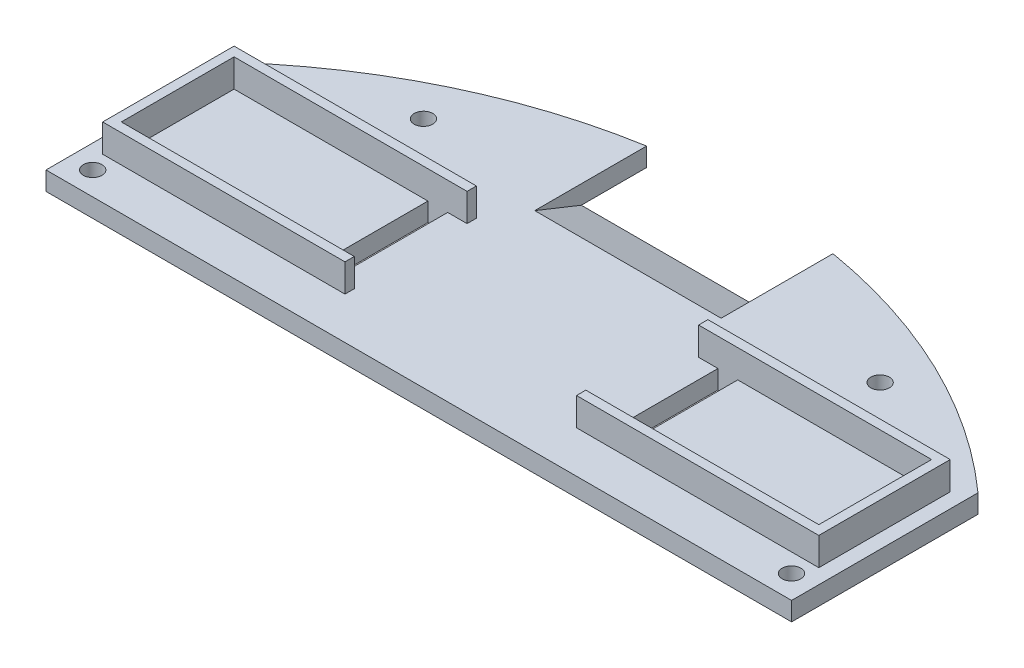
ISO-10303-21;
HEADER;
FILE_DESCRIPTION(('STEP AP214'),'2;1');
FILE_NAME('part.step','',(''),(''),'','','');
FILE_SCHEMA(('AUTOMOTIVE_DESIGN { 1 0 10303 214 1 1 1 1 }'));
ENDSEC;
DATA;
#1=APPLICATION_CONTEXT('core data for automotive mechanical design processes');
#2=APPLICATION_PROTOCOL_DEFINITION('international standard','automotive_design',2000,#1);
#3=PRODUCT_CONTEXT('',#1,'mechanical');
#4=PRODUCT('Part','Part','',(#3));
#5=PRODUCT_RELATED_PRODUCT_CATEGORY('part','',(#4));
#6=PRODUCT_DEFINITION_FORMATION('','',#4);
#7=PRODUCT_DEFINITION_CONTEXT('part definition',#1,'design');
#8=PRODUCT_DEFINITION('design','',#6,#7);
#9=PRODUCT_DEFINITION_SHAPE('','',#8);
#10=(LENGTH_UNIT() NAMED_UNIT(*) SI_UNIT(.MILLI.,.METRE.));
#11=(NAMED_UNIT(*) PLANE_ANGLE_UNIT() SI_UNIT($,.RADIAN.));
#12=(NAMED_UNIT(*) SI_UNIT($,.STERADIAN.) SOLID_ANGLE_UNIT());
#13=UNCERTAINTY_MEASURE_WITH_UNIT(LENGTH_MEASURE(1.E-05),#10,'distance_accuracy_value','');
#14=(GEOMETRIC_REPRESENTATION_CONTEXT(3) GLOBAL_UNCERTAINTY_ASSIGNED_CONTEXT((#13)) GLOBAL_UNIT_ASSIGNED_CONTEXT((#10,
#11,#12)) REPRESENTATION_CONTEXT('',''));
#15=CARTESIAN_POINT('',(0.,0.,0.));
#16=DIRECTION('',(0.,0.,1.));
#17=DIRECTION('',(1.,0.,0.));
#18=AXIS2_PLACEMENT_3D('',#15,#16,#17);
#19=CARTESIAN_POINT('',(0.,2.,34.7213595499958));
#20=DIRECTION('',(0.,-1.,0.));
#21=DIRECTION('',(0.,0.,-1.));
#22=AXIS2_PLACEMENT_3D('',#19,#20,#21);
#23=PLANE('',#22);
#24=DIRECTION('',(-1.,0.,0.));
#25=VECTOR('',#24,1.);
#26=CARTESIAN_POINT('',(-12.4199999977621,2.,4.5));
#27=LINE('',#26,#25);
#28=CARTESIAN_POINT('',(-16.62,2.,4.5));
#29=VERTEX_POINT('',#28);
#30=CARTESIAN_POINT('',(-37.42,2.,4.5));
#31=VERTEX_POINT('',#30);
#32=EDGE_CURVE('E281',#29,#31,#27,.T.);
#33=ORIENTED_EDGE('',*,*,#32,.F.);
#34=DIRECTION('',(0.,0.,1.));
#35=VECTOR('',#34,1.);
#36=CARTESIAN_POINT('',(-16.62,2.,-7.6));
#37=LINE('',#36,#35);
#38=CARTESIAN_POINT('',(-16.62,2.,-7.6));
#39=VERTEX_POINT('',#38);
#40=EDGE_CURVE('E369',#39,#29,#37,.T.);
#41=ORIENTED_EDGE('',*,*,#40,.F.);
#42=DIRECTION('',(1.,0.,0.));
#43=VECTOR('',#42,1.);
#44=CARTESIAN_POINT('',(-37.42,2.,-7.6));
#45=LINE('',#44,#43);
#46=CARTESIAN_POINT('',(-37.42,2.,-7.6));
#47=VERTEX_POINT('',#46);
#48=EDGE_CURVE('E925',#47,#39,#45,.T.);
#49=ORIENTED_EDGE('',*,*,#48,.F.);
#50=DIRECTION('',(0.,0.,-1.));
#51=VECTOR('',#50,1.);
#52=CARTESIAN_POINT('',(-37.42,2.,4.5));
#53=LINE('',#52,#51);
#54=EDGE_CURVE('E286',#31,#47,#53,.T.);
#55=ORIENTED_EDGE('',*,*,#54,.F.);
#56=EDGE_LOOP('',(#33,#41,#49,#55));
#57=FACE_BOUND('',#56,.T.);
#58=ADVANCED_FACE('F41',(#57),#23,.F.);
#59=DIRECTION('',(-1.,0.,0.));
#60=VECTOR('',#59,1.);
#61=CARTESIAN_POINT('',(12.4199999977621,2.,4.5));
#62=LINE('',#61,#60);
#63=CARTESIAN_POINT('',(14.5,2.,4.5));
#64=VERTEX_POINT('',#63);
#65=CARTESIAN_POINT('',(12.4199999977621,2.,4.5));
#66=VERTEX_POINT('',#65);
#67=EDGE_CURVE('E343',#64,#66,#62,.T.);
#68=ORIENTED_EDGE('',*,*,#67,.F.);
#69=DIRECTION('',(0.,0.,1.));
#70=VECTOR('',#69,1.);
#71=CARTESIAN_POINT('',(14.5,2.,-7.6));
#72=LINE('',#71,#70);
#73=CARTESIAN_POINT('',(14.5,2.,-7.6));
#74=VERTEX_POINT('',#73);
#75=EDGE_CURVE('E417',#74,#64,#72,.T.);
#76=ORIENTED_EDGE('',*,*,#75,.F.);
#77=DIRECTION('',(1.,0.,0.));
#78=VECTOR('',#77,1.);
#79=CARTESIAN_POINT('',(37.42,2.,-7.6));
#80=LINE('',#79,#78);
#81=CARTESIAN_POINT('',(12.4199999977621,2.,-7.6));
#82=VERTEX_POINT('',#81);
#83=EDGE_CURVE('E334',#82,#74,#80,.T.);
#84=ORIENTED_EDGE('',*,*,#83,.F.);
#85=DIRECTION('',(0.,0.,1.));
#86=VECTOR('',#85,1.);
#87=CARTESIAN_POINT('',(12.4199999977621,2.,-7.6));
#88=LINE('',#87,#86);
#89=CARTESIAN_POINT('',(12.4199999977621,2.,-8.5999999955243));
#90=VERTEX_POINT('',#89);
#91=EDGE_CURVE('E331',#90,#82,#88,.T.);
#92=ORIENTED_EDGE('',*,*,#91,.F.);
#93=DIRECTION('',(-1.,0.,0.));
#94=VECTOR('',#93,1.);
#95=CARTESIAN_POINT('',(38.4199999977621,2.,-8.5999999955243));
#96=LINE('',#95,#94);
#97=CARTESIAN_POINT('',(38.4199999977621,2.,-8.5999999955243));
#98=VERTEX_POINT('',#97);
#99=EDGE_CURVE('E328',#98,#90,#96,.T.);
#100=ORIENTED_EDGE('',*,*,#99,.F.);
#101=DIRECTION('',(0.,0.,-1.));
#102=VECTOR('',#101,1.);
#103=CARTESIAN_POINT('',(38.4199999977621,2.,5.4999999955243));
#104=LINE('',#103,#102);
#105=CARTESIAN_POINT('',(38.4199999977621,2.,5.4999999955243));
#106=VERTEX_POINT('',#105);
#107=EDGE_CURVE('E325',#106,#98,#104,.T.);
#108=ORIENTED_EDGE('',*,*,#107,.F.);
#109=DIRECTION('',(1.,0.,0.));
#110=VECTOR('',#109,1.);
#111=CARTESIAN_POINT('',(12.4199999977621,2.,5.4999999955243));
#112=LINE('',#111,#110);
#113=CARTESIAN_POINT('',(12.4199999977621,2.,5.4999999955243));
#114=VERTEX_POINT('',#113);
#115=EDGE_CURVE('E284',#114,#106,#112,.T.);
#116=ORIENTED_EDGE('',*,*,#115,.F.);
#117=DIRECTION('',(0.,0.,1.));
#118=VECTOR('',#117,1.);
#119=CARTESIAN_POINT('',(12.4199999977621,2.,4.5));
#120=LINE('',#119,#118);
#121=EDGE_CURVE('E280',#66,#114,#120,.T.);
#122=ORIENTED_EDGE('',*,*,#121,.F.);
#123=EDGE_LOOP('',(#68,#76,#84,#92,#100,#108,#116,#122));
#124=FACE_BOUND('',#123,.T.);
#125=CARTESIAN_POINT('',(24.5,2.,-15.));
#126=DIRECTION('',(0.,1.,0.));
#127=DIRECTION('',(0.,0.,-1.));
#128=AXIS2_PLACEMENT_3D('',#125,#126,#127);
#129=CIRCLE('',#128,1.00000000047268);
#130=CARTESIAN_POINT('',(24.5,2.,-16.0000000004727));
#131=VERTEX_POINT('',#130);
#132=EDGE_CURVE('E393',#131,#131,#129,.T.);
#133=ORIENTED_EDGE('',*,*,#132,.F.);
#134=EDGE_LOOP('',(#133));
#135=FACE_BOUND('',#134,.T.);
#136=CARTESIAN_POINT('',(37.4903810567666,2.,7.5));
#137=DIRECTION('',(0.,1.,0.));
#138=DIRECTION('',(0.,0.,-1.));
#139=AXIS2_PLACEMENT_3D('',#136,#137,#138);
#140=CIRCLE('',#139,0.999999999999998);
#141=CARTESIAN_POINT('',(37.4903810567666,2.,6.5));
#142=VERTEX_POINT('',#141);
#143=EDGE_CURVE('E399',#142,#142,#140,.T.);
#144=ORIENTED_EDGE('',*,*,#143,.F.);
#145=EDGE_LOOP('',(#144));
#146=FACE_BOUND('',#145,.T.);
#147=CARTESIAN_POINT('',(-24.5,2.,-15.));
#148=DIRECTION('',(0.,1.,0.));
#149=DIRECTION('',(0.,0.,1.));
#150=AXIS2_PLACEMENT_3D('',#147,#148,#149);
#151=CIRCLE('',#150,1.00000000047268);
#152=CARTESIAN_POINT('',(-24.5,2.,-13.9999999995273));
#153=VERTEX_POINT('',#152);
#154=EDGE_CURVE('E405',#153,#153,#151,.T.);
#155=ORIENTED_EDGE('',*,*,#154,.F.);
#156=EDGE_LOOP('',(#155));
#157=FACE_BOUND('',#156,.T.);
#158=CARTESIAN_POINT('',(-37.4903810567666,2.,7.5));
#159=DIRECTION('',(0.,1.,0.));
#160=DIRECTION('',(0.,0.,1.));
#161=AXIS2_PLACEMENT_3D('',#158,#159,#160);
#162=CIRCLE('',#161,0.999999999999998);
#163=CARTESIAN_POINT('',(-37.4903810567666,2.,8.5));
#164=VERTEX_POINT('',#163);
#165=EDGE_CURVE('E411',#164,#164,#162,.T.);
#166=ORIENTED_EDGE('',*,*,#165,.F.);
#167=EDGE_LOOP('',(#166));
#168=FACE_BOUND('',#167,.T.);
#169=DIRECTION('',(-1.,0.,0.));
#170=VECTOR('',#169,1.);
#171=CARTESIAN_POINT('',(0.,2.,-12.4394382810003));
#172=LINE('',#171,#170);
#173=CARTESIAN_POINT('',(10.,2.,-12.4394382810003));
#174=VERTEX_POINT('',#173);
#175=CARTESIAN_POINT('',(-10.,2.,-12.4394382810003));
#176=VERTEX_POINT('',#175);
#177=EDGE_CURVE('E492',#174,#176,#172,.T.);
#178=ORIENTED_EDGE('',*,*,#177,.T.);
#179=DIRECTION('',(0.,0.,-1.));
#180=VECTOR('',#179,1.);
#181=CARTESIAN_POINT('',(-10.,2.,-24.4394382810004));
#182=LINE('',#181,#180);
#183=CARTESIAN_POINT('',(-10.,2.,-24.4394382810004));
#184=VERTEX_POINT('',#183);
#185=EDGE_CURVE('E57',#176,#184,#182,.T.);
#186=ORIENTED_EDGE('',*,*,#185,.T.);
#187=CARTESIAN_POINT('',(0.,2.,34.7213595499958));
#188=DIRECTION('',(0.,1.,0.));
#189=DIRECTION('',(0.,0.,-1.));
#190=AXIS2_PLACEMENT_3D('',#187,#188,#189);
#191=CIRCLE('',#190,60.);
#192=CARTESIAN_POINT('',(-40.,2.,-10.));
#193=VERTEX_POINT('',#192);
#194=EDGE_CURVE('E450',#184,#193,#191,.T.);
#195=ORIENTED_EDGE('',*,*,#194,.T.);
#196=DIRECTION('',(0.,0.,1.));
#197=VECTOR('',#196,1.);
#198=CARTESIAN_POINT('',(-40.,2.,10.));
#199=LINE('',#198,#197);
#200=CARTESIAN_POINT('',(-40.,2.,10.));
#201=VERTEX_POINT('',#200);
#202=EDGE_CURVE('E452',#193,#201,#199,.T.);
#203=ORIENTED_EDGE('',*,*,#202,.T.);
#204=DIRECTION('',(1.,0.,0.));
#205=VECTOR('',#204,1.);
#206=CARTESIAN_POINT('',(-40.,2.,10.));
#207=LINE('',#206,#205);
#208=CARTESIAN_POINT('',(40.,2.,10.));
#209=VERTEX_POINT('',#208);
#210=EDGE_CURVE('E454',#201,#209,#207,.T.);
#211=ORIENTED_EDGE('',*,*,#210,.T.);
#212=DIRECTION('',(0.,0.,-1.));
#213=VECTOR('',#212,1.);
#214=CARTESIAN_POINT('',(40.,2.,10.));
#215=LINE('',#214,#213);
#216=CARTESIAN_POINT('',(40.,2.,-10.));
#217=VERTEX_POINT('',#216);
#218=EDGE_CURVE('E456',#209,#217,#215,.T.);
#219=ORIENTED_EDGE('',*,*,#218,.T.);
#220=CARTESIAN_POINT('',(0.,2.,34.7213595499958));
#221=DIRECTION('',(0.,1.,0.));
#222=DIRECTION('',(0.,0.,-1.));
#223=AXIS2_PLACEMENT_3D('',#220,#221,#222);
#224=CIRCLE('',#223,60.);
#225=CARTESIAN_POINT('',(10.,2.,-24.4394382810004));
#226=VERTEX_POINT('',#225);
#227=EDGE_CURVE('E445',#217,#226,#224,.T.);
#228=ORIENTED_EDGE('',*,*,#227,.T.);
#229=DIRECTION('',(0.,0.,1.));
#230=VECTOR('',#229,1.);
#231=CARTESIAN_POINT('',(10.,2.,-17.4394382810004));
#232=LINE('',#231,#230);
#233=EDGE_CURVE('E65',#226,#174,#232,.T.);
#234=ORIENTED_EDGE('',*,*,#233,.T.);
#235=EDGE_LOOP('',(#178,#186,#195,#203,#211,#219,#228,#234));
#236=FACE_BOUND('',#235,.T.);
#237=CARTESIAN_POINT('',(-12.4199999977621,2.,4.5));
#238=VERTEX_POINT('',#237);
#239=CARTESIAN_POINT('',(-14.5,2.,4.50000000000001));
#240=VERTEX_POINT('',#239);
#241=EDGE_CURVE('E270',#238,#240,#27,.T.);
#242=ORIENTED_EDGE('',*,*,#241,.F.);
#243=DIRECTION('',(0.,0.,-1.));
#244=VECTOR('',#243,1.);
#245=CARTESIAN_POINT('',(-12.4199999977621,2.,4.5));
#246=LINE('',#245,#244);
#247=CARTESIAN_POINT('',(-12.4199999977621,2.,5.4999999955243));
#248=VERTEX_POINT('',#247);
#249=EDGE_CURVE('E252',#248,#238,#246,.T.);
#250=ORIENTED_EDGE('',*,*,#249,.F.);
#251=DIRECTION('',(1.,0.,0.));
#252=VECTOR('',#251,1.);
#253=CARTESIAN_POINT('',(-12.4199999977621,2.,5.4999999955243));
#254=LINE('',#253,#252);
#255=CARTESIAN_POINT('',(-38.4199999977621,2.,5.4999999955243));
#256=VERTEX_POINT('',#255);
#257=EDGE_CURVE('E263',#256,#248,#254,.T.);
#258=ORIENTED_EDGE('',*,*,#257,.F.);
#259=DIRECTION('',(0.,0.,1.));
#260=VECTOR('',#259,1.);
#261=CARTESIAN_POINT('',(-38.4199999977621,2.,5.4999999955243));
#262=LINE('',#261,#260);
#263=CARTESIAN_POINT('',(-38.4199999977621,2.,-8.5999999955243));
#264=VERTEX_POINT('',#263);
#265=EDGE_CURVE('E919',#264,#256,#262,.T.);
#266=ORIENTED_EDGE('',*,*,#265,.F.);
#267=DIRECTION('',(-1.,0.,0.));
#268=VECTOR('',#267,1.);
#269=CARTESIAN_POINT('',(-38.4199999977621,2.,-8.5999999955243));
#270=LINE('',#269,#268);
#271=CARTESIAN_POINT('',(-12.4199999977621,2.,-8.5999999955243));
#272=VERTEX_POINT('',#271);
#273=EDGE_CURVE('E921',#272,#264,#270,.T.);
#274=ORIENTED_EDGE('',*,*,#273,.F.);
#275=DIRECTION('',(0.,0.,-1.));
#276=VECTOR('',#275,1.);
#277=CARTESIAN_POINT('',(-12.4199999977621,2.,-7.6));
#278=LINE('',#277,#276);
#279=CARTESIAN_POINT('',(-12.4199999977621,2.,-7.6));
#280=VERTEX_POINT('',#279);
#281=EDGE_CURVE('E923',#280,#272,#278,.T.);
#282=ORIENTED_EDGE('',*,*,#281,.F.);
#283=CARTESIAN_POINT('',(-14.5,2.,-7.6));
#284=VERTEX_POINT('',#283);
#285=EDGE_CURVE('E924',#284,#280,#45,.T.);
#286=ORIENTED_EDGE('',*,*,#285,.F.);
#287=DIRECTION('',(0.,0.,-1.));
#288=VECTOR('',#287,1.);
#289=CARTESIAN_POINT('',(-14.5,2.,-7.6));
#290=LINE('',#289,#288);
#291=EDGE_CURVE('E279',#240,#284,#290,.T.);
#292=ORIENTED_EDGE('',*,*,#291,.F.);
#293=EDGE_LOOP('',(#242,#250,#258,#266,#274,#282,#286,#292));
#294=FACE_BOUND('',#293,.T.);
#295=ADVANCED_FACE('F277',(#124,#135,#146,#157,#168,#236,#294),#23,.F.);
#296=CARTESIAN_POINT('',(37.42,2.,4.5));
#297=VERTEX_POINT('',#296);
#298=CARTESIAN_POINT('',(16.62,2.,4.5));
#299=VERTEX_POINT('',#298);
#300=EDGE_CURVE('E308',#297,#299,#62,.T.);
#301=ORIENTED_EDGE('',*,*,#300,.F.);
#302=DIRECTION('',(0.,0.,1.));
#303=VECTOR('',#302,1.);
#304=CARTESIAN_POINT('',(37.42,2.,4.5));
#305=LINE('',#304,#303);
#306=CARTESIAN_POINT('',(37.42,2.,-7.6));
#307=VERTEX_POINT('',#306);
#308=EDGE_CURVE('E337',#307,#297,#305,.T.);
#309=ORIENTED_EDGE('',*,*,#308,.F.);
#310=CARTESIAN_POINT('',(16.62,2.,-7.6));
#311=VERTEX_POINT('',#310);
#312=EDGE_CURVE('E338',#311,#307,#80,.T.);
#313=ORIENTED_EDGE('',*,*,#312,.F.);
#314=DIRECTION('',(0.,0.,-1.));
#315=VECTOR('',#314,1.);
#316=CARTESIAN_POINT('',(16.62,2.,-7.6));
#317=LINE('',#316,#315);
#318=EDGE_CURVE('E420',#299,#311,#317,.T.);
#319=ORIENTED_EDGE('',*,*,#318,.F.);
#320=EDGE_LOOP('',(#301,#309,#313,#319));
#321=FACE_BOUND('',#320,.T.);
#322=ADVANCED_FACE('F530',(#321),#23,.F.);
#323=CARTESIAN_POINT('',(0.,0.,34.7213595499958));
#324=DIRECTION('',(0.,-1.,0.));
#325=DIRECTION('',(0.,0.,-1.));
#326=AXIS2_PLACEMENT_3D('',#323,#324,#325);
#327=PLANE('',#326);
#328=CARTESIAN_POINT('',(37.4903810567666,0.,7.5));
#329=DIRECTION('',(0.,1.,0.));
#330=DIRECTION('',(0.,0.,-1.));
#331=AXIS2_PLACEMENT_3D('',#328,#329,#330);
#332=CIRCLE('',#331,0.999999999999998);
#333=CARTESIAN_POINT('',(37.4903810567666,0.,6.5));
#334=VERTEX_POINT('',#333);
#335=EDGE_CURVE('E396',#334,#334,#332,.T.);
#336=ORIENTED_EDGE('',*,*,#335,.T.);
#337=EDGE_LOOP('',(#336));
#338=FACE_BOUND('',#337,.T.);
#339=CARTESIAN_POINT('',(-37.4903810567666,0.,7.5));
#340=DIRECTION('',(0.,1.,0.));
#341=DIRECTION('',(0.,0.,1.));
#342=AXIS2_PLACEMENT_3D('',#339,#340,#341);
#343=CIRCLE('',#342,0.999999999999998);
#344=CARTESIAN_POINT('',(-37.4903810567666,0.,8.5));
#345=VERTEX_POINT('',#344);
#346=EDGE_CURVE('E408',#345,#345,#343,.T.);
#347=ORIENTED_EDGE('',*,*,#346,.T.);
#348=EDGE_LOOP('',(#347));
#349=FACE_BOUND('',#348,.T.);
#350=CARTESIAN_POINT('',(0.,0.,34.7213595499958));
#351=DIRECTION('',(0.,1.,0.));
#352=DIRECTION('',(0.,0.,-1.));
#353=AXIS2_PLACEMENT_3D('',#350,#351,#352);
#354=CIRCLE('',#353,60.);
#355=CARTESIAN_POINT('',(40.,0.,-10.));
#356=VERTEX_POINT('',#355);
#357=CARTESIAN_POINT('',(10.,0.,-24.4394382810004));
#358=VERTEX_POINT('',#357);
#359=EDGE_CURVE('E444',#356,#358,#354,.T.);
#360=ORIENTED_EDGE('',*,*,#359,.F.);
#361=DIRECTION('',(0.,0.,-1.));
#362=VECTOR('',#361,1.);
#363=CARTESIAN_POINT('',(40.,0.,10.));
#364=LINE('',#363,#362);
#365=CARTESIAN_POINT('',(40.,0.,10.));
#366=VERTEX_POINT('',#365);
#367=EDGE_CURVE('E447',#366,#356,#364,.T.);
#368=ORIENTED_EDGE('',*,*,#367,.F.);
#369=DIRECTION('',(1.,0.,0.));
#370=VECTOR('',#369,1.);
#371=CARTESIAN_POINT('',(-40.,0.,10.));
#372=LINE('',#371,#370);
#373=CARTESIAN_POINT('',(-40.,0.,10.));
#374=VERTEX_POINT('',#373);
#375=EDGE_CURVE('E472',#374,#366,#372,.T.);
#376=ORIENTED_EDGE('',*,*,#375,.F.);
#377=DIRECTION('',(0.,0.,1.));
#378=VECTOR('',#377,1.);
#379=CARTESIAN_POINT('',(-40.,0.,10.));
#380=LINE('',#379,#378);
#381=CARTESIAN_POINT('',(-40.,0.,-10.));
#382=VERTEX_POINT('',#381);
#383=EDGE_CURVE('E470',#382,#374,#380,.T.);
#384=ORIENTED_EDGE('',*,*,#383,.F.);
#385=CARTESIAN_POINT('',(0.,0.,34.7213595499958));
#386=DIRECTION('',(0.,1.,0.));
#387=DIRECTION('',(0.,0.,-1.));
#388=AXIS2_PLACEMENT_3D('',#385,#386,#387);
#389=CIRCLE('',#388,60.);
#390=CARTESIAN_POINT('',(-10.,0.,-24.4394382810004));
#391=VERTEX_POINT('',#390);
#392=EDGE_CURVE('E468',#391,#382,#389,.T.);
#393=ORIENTED_EDGE('',*,*,#392,.F.);
#394=DIRECTION('',(0.,0.,-1.));
#395=VECTOR('',#394,1.);
#396=CARTESIAN_POINT('',(-10.,0.,-24.4394382810004));
#397=LINE('',#396,#395);
#398=CARTESIAN_POINT('',(-10.,0.,-17.4394382810004));
#399=VERTEX_POINT('',#398);
#400=EDGE_CURVE('E466',#399,#391,#397,.T.);
#401=ORIENTED_EDGE('',*,*,#400,.F.);
#402=DIRECTION('',(-1.,0.,0.));
#403=VECTOR('',#402,1.);
#404=CARTESIAN_POINT('',(-10.,0.,-17.4394382810004));
#405=LINE('',#404,#403);
#406=CARTESIAN_POINT('',(10.,0.,-17.4394382810004));
#407=VERTEX_POINT('',#406);
#408=EDGE_CURVE('E463',#407,#399,#405,.T.);
#409=ORIENTED_EDGE('',*,*,#408,.F.);
#410=DIRECTION('',(0.,0.,1.));
#411=VECTOR('',#410,1.);
#412=CARTESIAN_POINT('',(10.,0.,-17.4394382810004));
#413=LINE('',#412,#411);
#414=EDGE_CURVE('E461',#358,#407,#413,.T.);
#415=ORIENTED_EDGE('',*,*,#414,.F.);
#416=EDGE_LOOP('',(#360,#368,#376,#384,#393,#401,#409,#415));
#417=FACE_BOUND('',#416,.T.);
#418=DIRECTION('',(-1.,0.,0.));
#419=VECTOR('',#418,1.);
#420=CARTESIAN_POINT('',(14.5,0.,-7.6));
#421=LINE('',#420,#419);
#422=CARTESIAN_POINT('',(16.62,0.,-7.6));
#423=VERTEX_POINT('',#422);
#424=CARTESIAN_POINT('',(14.5,0.,-7.6));
#425=VERTEX_POINT('',#424);
#426=EDGE_CURVE('E421',#423,#425,#421,.T.);
#427=ORIENTED_EDGE('',*,*,#426,.T.);
#428=DIRECTION('',(0.,0.,1.));
#429=VECTOR('',#428,1.);
#430=CARTESIAN_POINT('',(14.5,0.,-7.6));
#431=LINE('',#430,#429);
#432=CARTESIAN_POINT('',(14.5,0.,4.5));
#433=VERTEX_POINT('',#432);
#434=EDGE_CURVE('E414',#425,#433,#431,.T.);
#435=ORIENTED_EDGE('',*,*,#434,.T.);
#436=DIRECTION('',(1.,0.,0.));
#437=VECTOR('',#436,1.);
#438=CARTESIAN_POINT('',(14.5,0.,4.5));
#439=LINE('',#438,#437);
#440=CARTESIAN_POINT('',(16.62,0.,4.5));
#441=VERTEX_POINT('',#440);
#442=EDGE_CURVE('E427',#433,#441,#439,.T.);
#443=ORIENTED_EDGE('',*,*,#442,.T.);
#444=DIRECTION('',(0.,0.,-1.));
#445=VECTOR('',#444,1.);
#446=CARTESIAN_POINT('',(16.62,0.,-7.6));
#447=LINE('',#446,#445);
#448=EDGE_CURVE('E430',#441,#423,#447,.T.);
#449=ORIENTED_EDGE('',*,*,#448,.T.);
#450=EDGE_LOOP('',(#427,#435,#443,#449));
#451=FACE_BOUND('',#450,.T.);
#452=CARTESIAN_POINT('',(-24.5,0.,-15.));
#453=DIRECTION('',(0.,1.,0.));
#454=DIRECTION('',(0.,0.,1.));
#455=AXIS2_PLACEMENT_3D('',#452,#453,#454);
#456=CIRCLE('',#455,1.00000000047268);
#457=CARTESIAN_POINT('',(-24.5,0.,-13.9999999995273));
#458=VERTEX_POINT('',#457);
#459=EDGE_CURVE('E402',#458,#458,#456,.T.);
#460=ORIENTED_EDGE('',*,*,#459,.T.);
#461=EDGE_LOOP('',(#460));
#462=FACE_BOUND('',#461,.T.);
#463=CARTESIAN_POINT('',(24.5,0.,-15.));
#464=DIRECTION('',(0.,1.,0.));
#465=DIRECTION('',(0.,0.,-1.));
#466=AXIS2_PLACEMENT_3D('',#463,#464,#465);
#467=CIRCLE('',#466,1.00000000047268);
#468=CARTESIAN_POINT('',(24.5,0.,-16.0000000004727));
#469=VERTEX_POINT('',#468);
#470=EDGE_CURVE('E392',#469,#469,#467,.T.);
#471=ORIENTED_EDGE('',*,*,#470,.T.);
#472=EDGE_LOOP('',(#471));
#473=FACE_BOUND('',#472,.T.);
#474=DIRECTION('',(1.,0.,0.));
#475=VECTOR('',#474,1.);
#476=CARTESIAN_POINT('',(-14.5,0.,4.50000000000001));
#477=LINE('',#476,#475);
#478=CARTESIAN_POINT('',(-16.62,0.,4.5));
#479=VERTEX_POINT('',#478);
#480=CARTESIAN_POINT('',(-14.5,0.,4.5));
#481=VERTEX_POINT('',#480);
#482=EDGE_CURVE('E370',#479,#481,#477,.T.);
#483=ORIENTED_EDGE('',*,*,#482,.T.);
#484=DIRECTION('',(0.,0.,-1.));
#485=VECTOR('',#484,1.);
#486=CARTESIAN_POINT('',(-14.5,0.,-7.6));
#487=LINE('',#486,#485);
#488=CARTESIAN_POINT('',(-14.5,0.,-7.6));
#489=VERTEX_POINT('',#488);
#490=EDGE_CURVE('E367',#481,#489,#487,.T.);
#491=ORIENTED_EDGE('',*,*,#490,.T.);
#492=DIRECTION('',(-1.,0.,0.));
#493=VECTOR('',#492,1.);
#494=CARTESIAN_POINT('',(-14.5,0.,-7.6));
#495=LINE('',#494,#493);
#496=CARTESIAN_POINT('',(-16.62,0.,-7.6));
#497=VERTEX_POINT('',#496);
#498=EDGE_CURVE('E376',#489,#497,#495,.T.);
#499=ORIENTED_EDGE('',*,*,#498,.T.);
#500=DIRECTION('',(0.,0.,1.));
#501=VECTOR('',#500,1.);
#502=CARTESIAN_POINT('',(-16.62,0.,-7.6));
#503=LINE('',#502,#501);
#504=EDGE_CURVE('E379',#497,#479,#503,.T.);
#505=ORIENTED_EDGE('',*,*,#504,.T.);
#506=EDGE_LOOP('',(#483,#491,#499,#505));
#507=FACE_BOUND('',#506,.T.);
#508=ADVANCED_FACE('F501',(#338,#349,#417,#451,#462,#473,#507),#327,.T.);
#509=CARTESIAN_POINT('',(0.,2.,34.7213595499958));
#510=DIRECTION('',(0.,-1.,0.));
#511=DIRECTION('',(0.,0.,-1.));
#512=AXIS2_PLACEMENT_3D('',#509,#510,#511);
#513=CYLINDRICAL_SURFACE('',#512,60.);
#514=ORIENTED_EDGE('',*,*,#359,.T.);
#515=DIRECTION('',(0.,-1.,0.));
#516=VECTOR('',#515,1.);
#517=CARTESIAN_POINT('',(10.,2.,-24.4394382810004));
#518=LINE('',#517,#516);
#519=EDGE_CURVE('E489',#226,#358,#518,.T.);
#520=ORIENTED_EDGE('',*,*,#519,.F.);
#521=ORIENTED_EDGE('',*,*,#227,.F.);
#522=DIRECTION('',(0.,-1.,0.));
#523=VECTOR('',#522,1.);
#524=CARTESIAN_POINT('',(40.,2.,-10.));
#525=LINE('',#524,#523);
#526=EDGE_CURVE('E458',#217,#356,#525,.T.);
#527=ORIENTED_EDGE('',*,*,#526,.T.);
#528=EDGE_LOOP('',(#514,#520,#521,#527));
#529=FACE_BOUND('',#528,.T.);
#530=ADVANCED_FACE('F511',(#529),#513,.T.);
#531=CARTESIAN_POINT('',(10.,2.,-17.4394382810004));
#532=DIRECTION('',(1.,0.,0.));
#533=DIRECTION('',(0.,0.,-1.));
#534=AXIS2_PLACEMENT_3D('',#531,#532,#533);
#535=PLANE('',#534);
#536=ORIENTED_EDGE('',*,*,#414,.T.);
#537=DIRECTION('',(0.,-0.371390676354101,-0.92847669088526));
#538=VECTOR('',#537,1.);
#539=CARTESIAN_POINT('',(10.,0.275862068965512,-16.7497831085866));
#540=LINE('',#539,#538);
#541=EDGE_CURVE('E11',#407,#174,#540,.F.);
#542=ORIENTED_EDGE('',*,*,#541,.T.);
#543=ORIENTED_EDGE('',*,*,#233,.F.);
#544=ORIENTED_EDGE('',*,*,#519,.T.);
#545=EDGE_LOOP('',(#536,#542,#543,#544));
#546=FACE_BOUND('',#545,.T.);
#547=ADVANCED_FACE('F506',(#546),#535,.F.);
#548=CARTESIAN_POINT('',(-10.,2.,-24.4394382810004));
#549=DIRECTION('',(-1.,0.,0.));
#550=DIRECTION('',(0.,0.,1.));
#551=AXIS2_PLACEMENT_3D('',#548,#549,#550);
#552=PLANE('',#551);
#553=ORIENTED_EDGE('',*,*,#400,.T.);
#554=DIRECTION('',(0.,-1.,0.));
#555=VECTOR('',#554,1.);
#556=CARTESIAN_POINT('',(-10.,2.,-24.4394382810004));
#557=LINE('',#556,#555);
#558=EDGE_CURVE('E486',#184,#391,#557,.T.);
#559=ORIENTED_EDGE('',*,*,#558,.F.);
#560=ORIENTED_EDGE('',*,*,#185,.F.);
#561=DIRECTION('',(0.,0.371390676354101,0.92847669088526));
#562=VECTOR('',#561,1.);
#563=CARTESIAN_POINT('',(-10.,-2.13793103448275,-22.7842658672073));
#564=LINE('',#563,#562);
#565=EDGE_CURVE('E50',#176,#399,#564,.F.);
#566=ORIENTED_EDGE('',*,*,#565,.T.);
#567=EDGE_LOOP('',(#553,#559,#560,#566));
#568=FACE_BOUND('',#567,.T.);
#569=ADVANCED_FACE('F494',(#568),#552,.F.);
#570=CARTESIAN_POINT('',(0.,2.,34.7213595499958));
#571=DIRECTION('',(0.,-1.,0.));
#572=DIRECTION('',(0.,0.,-1.));
#573=AXIS2_PLACEMENT_3D('',#570,#571,#572);
#574=CYLINDRICAL_SURFACE('',#573,60.);
#575=ORIENTED_EDGE('',*,*,#392,.T.);
#576=DIRECTION('',(0.,-1.,0.));
#577=VECTOR('',#576,1.);
#578=CARTESIAN_POINT('',(-40.,2.,-10.));
#579=LINE('',#578,#577);
#580=EDGE_CURVE('E483',#193,#382,#579,.T.);
#581=ORIENTED_EDGE('',*,*,#580,.F.);
#582=ORIENTED_EDGE('',*,*,#194,.F.);
#583=ORIENTED_EDGE('',*,*,#558,.T.);
#584=EDGE_LOOP('',(#575,#581,#582,#583));
#585=FACE_BOUND('',#584,.T.);
#586=ADVANCED_FACE('F528',(#585),#574,.T.);
#587=CARTESIAN_POINT('',(-40.,2.,10.));
#588=DIRECTION('',(1.,0.,0.));
#589=DIRECTION('',(0.,0.,-1.));
#590=AXIS2_PLACEMENT_3D('',#587,#588,#589);
#591=PLANE('',#590);
#592=ORIENTED_EDGE('',*,*,#383,.T.);
#593=DIRECTION('',(0.,-1.,0.));
#594=VECTOR('',#593,1.);
#595=CARTESIAN_POINT('',(-40.,2.,10.));
#596=LINE('',#595,#594);
#597=EDGE_CURVE('E480',#201,#374,#596,.T.);
#598=ORIENTED_EDGE('',*,*,#597,.F.);
#599=ORIENTED_EDGE('',*,*,#202,.F.);
#600=ORIENTED_EDGE('',*,*,#580,.T.);
#601=EDGE_LOOP('',(#592,#598,#599,#600));
#602=FACE_BOUND('',#601,.T.);
#603=ADVANCED_FACE('F523',(#602),#591,.F.);
#604=CARTESIAN_POINT('',(-40.,2.,10.));
#605=DIRECTION('',(0.,0.,-1.));
#606=DIRECTION('',(-1.,0.,0.));
#607=AXIS2_PLACEMENT_3D('',#604,#605,#606);
#608=PLANE('',#607);
#609=ORIENTED_EDGE('',*,*,#375,.T.);
#610=DIRECTION('',(0.,-1.,0.));
#611=VECTOR('',#610,1.);
#612=CARTESIAN_POINT('',(40.,2.,10.));
#613=LINE('',#612,#611);
#614=EDGE_CURVE('E477',#209,#366,#613,.T.);
#615=ORIENTED_EDGE('',*,*,#614,.F.);
#616=ORIENTED_EDGE('',*,*,#210,.F.);
#617=ORIENTED_EDGE('',*,*,#597,.T.);
#618=EDGE_LOOP('',(#609,#615,#616,#617));
#619=FACE_BOUND('',#618,.T.);
#620=ADVANCED_FACE('F520',(#619),#608,.F.);
#621=CARTESIAN_POINT('',(40.,2.,10.));
#622=DIRECTION('',(-1.,0.,0.));
#623=DIRECTION('',(0.,0.,1.));
#624=AXIS2_PLACEMENT_3D('',#621,#622,#623);
#625=PLANE('',#624);
#626=ORIENTED_EDGE('',*,*,#367,.T.);
#627=ORIENTED_EDGE('',*,*,#526,.F.);
#628=ORIENTED_EDGE('',*,*,#218,.F.);
#629=ORIENTED_EDGE('',*,*,#614,.T.);
#630=EDGE_LOOP('',(#626,#627,#628,#629));
#631=FACE_BOUND('',#630,.T.);
#632=ADVANCED_FACE('F516',(#631),#625,.F.);
#633=CARTESIAN_POINT('',(14.5,2.,-7.6));
#634=DIRECTION('',(1.,0.,0.));
#635=DIRECTION('',(0.,0.,-1.));
#636=AXIS2_PLACEMENT_3D('',#633,#634,#635);
#637=PLANE('',#636);
#638=ORIENTED_EDGE('',*,*,#434,.F.);
#639=DIRECTION('',(0.,-1.,0.));
#640=VECTOR('',#639,1.);
#641=CARTESIAN_POINT('',(14.5,2.,-7.6));
#642=LINE('',#641,#640);
#643=EDGE_CURVE('E424',#74,#425,#642,.T.);
#644=ORIENTED_EDGE('',*,*,#643,.F.);
#645=ORIENTED_EDGE('',*,*,#75,.T.);
#646=DIRECTION('',(0.,-1.,0.));
#647=VECTOR('',#646,1.);
#648=CARTESIAN_POINT('',(14.5,2.,4.5));
#649=LINE('',#648,#647);
#650=EDGE_CURVE('E441',#64,#433,#649,.T.);
#651=ORIENTED_EDGE('',*,*,#650,.T.);
#652=EDGE_LOOP('',(#638,#644,#645,#651));
#653=FACE_BOUND('',#652,.T.);
#654=ADVANCED_FACE('F544',(#653),#637,.T.);
#655=CARTESIAN_POINT('',(14.5,2.,4.5));
#656=DIRECTION('',(0.,0.,-1.));
#657=DIRECTION('',(-1.,0.,0.));
#658=AXIS2_PLACEMENT_3D('',#655,#656,#657);
#659=PLANE('',#658);
#660=ORIENTED_EDGE('',*,*,#442,.F.);
#661=ORIENTED_EDGE('',*,*,#650,.F.);
#662=ORIENTED_EDGE('',*,*,#67,.T.);
#663=DIRECTION('',(0.,-1.,0.));
#664=VECTOR('',#663,1.);
#665=CARTESIAN_POINT('',(12.4199999977621,5.,4.5));
#666=LINE('',#665,#664);
#667=CARTESIAN_POINT('',(12.4199999977621,5.,4.5));
#668=VERTEX_POINT('',#667);
#669=EDGE_CURVE('E321',#668,#66,#666,.T.);
#670=ORIENTED_EDGE('',*,*,#669,.F.);
#671=DIRECTION('',(-1.,0.,0.));
#672=VECTOR('',#671,1.);
#673=CARTESIAN_POINT('',(12.4199999977621,5.,4.5));
#674=LINE('',#673,#672);
#675=CARTESIAN_POINT('',(37.42,5.,4.5));
#676=VERTEX_POINT('',#675);
#677=EDGE_CURVE('E320',#676,#668,#674,.T.);
#678=ORIENTED_EDGE('',*,*,#677,.F.);
#679=DIRECTION('',(0.,-1.,0.));
#680=VECTOR('',#679,1.);
#681=CARTESIAN_POINT('',(37.42,5.,4.5));
#682=LINE('',#681,#680);
#683=EDGE_CURVE('E346',#676,#297,#682,.T.);
#684=ORIENTED_EDGE('',*,*,#683,.T.);
#685=ORIENTED_EDGE('',*,*,#300,.T.);
#686=DIRECTION('',(0.,-1.,0.));
#687=VECTOR('',#686,1.);
#688=CARTESIAN_POINT('',(16.62,2.,4.5));
#689=LINE('',#688,#687);
#690=EDGE_CURVE('E439',#299,#441,#689,.T.);
#691=ORIENTED_EDGE('',*,*,#690,.T.);
#692=EDGE_LOOP('',(#660,#661,#662,#670,#678,#684,#685,#691));
#693=FACE_BOUND('',#692,.T.);
#694=ADVANCED_FACE('F644',(#693),#659,.T.);
#695=CARTESIAN_POINT('',(16.62,2.,-7.6));
#696=DIRECTION('',(-1.,0.,0.));
#697=DIRECTION('',(0.,0.,1.));
#698=AXIS2_PLACEMENT_3D('',#695,#696,#697);
#699=PLANE('',#698);
#700=ORIENTED_EDGE('',*,*,#448,.F.);
#701=ORIENTED_EDGE('',*,*,#690,.F.);
#702=ORIENTED_EDGE('',*,*,#318,.T.);
#703=DIRECTION('',(0.,-1.,0.));
#704=VECTOR('',#703,1.);
#705=CARTESIAN_POINT('',(16.62,2.,-7.6));
#706=LINE('',#705,#704);
#707=EDGE_CURVE('E437',#311,#423,#706,.T.);
#708=ORIENTED_EDGE('',*,*,#707,.T.);
#709=EDGE_LOOP('',(#700,#701,#702,#708));
#710=FACE_BOUND('',#709,.T.);
#711=ADVANCED_FACE('F652',(#710),#699,.T.);
#712=CARTESIAN_POINT('',(14.5,2.,-7.6));
#713=DIRECTION('',(0.,0.,1.));
#714=DIRECTION('',(1.,0.,0.));
#715=AXIS2_PLACEMENT_3D('',#712,#713,#714);
#716=PLANE('',#715);
#717=ORIENTED_EDGE('',*,*,#426,.F.);
#718=ORIENTED_EDGE('',*,*,#707,.F.);
#719=ORIENTED_EDGE('',*,*,#312,.T.);
#720=DIRECTION('',(0.,-1.,0.));
#721=VECTOR('',#720,1.);
#722=CARTESIAN_POINT('',(37.42,5.,-7.6));
#723=LINE('',#722,#721);
#724=CARTESIAN_POINT('',(37.42,5.,-7.6));
#725=VERTEX_POINT('',#724);
#726=EDGE_CURVE('E349',#725,#307,#723,.T.);
#727=ORIENTED_EDGE('',*,*,#726,.F.);
#728=DIRECTION('',(1.,0.,0.));
#729=VECTOR('',#728,1.);
#730=CARTESIAN_POINT('',(37.42,5.,-7.6));
#731=LINE('',#730,#729);
#732=CARTESIAN_POINT('',(12.4199999977621,5.,-7.6));
#733=VERTEX_POINT('',#732);
#734=EDGE_CURVE('E316',#733,#725,#731,.T.);
#735=ORIENTED_EDGE('',*,*,#734,.F.);
#736=DIRECTION('',(0.,-1.,0.));
#737=VECTOR('',#736,1.);
#738=CARTESIAN_POINT('',(12.4199999977621,5.,-7.6));
#739=LINE('',#738,#737);
#740=EDGE_CURVE('E352',#733,#82,#739,.T.);
#741=ORIENTED_EDGE('',*,*,#740,.T.);
#742=ORIENTED_EDGE('',*,*,#83,.T.);
#743=ORIENTED_EDGE('',*,*,#643,.T.);
#744=EDGE_LOOP('',(#717,#718,#719,#727,#735,#741,#742,#743));
#745=FACE_BOUND('',#744,.T.);
#746=ADVANCED_FACE('F595',(#745),#716,.T.);
#747=CARTESIAN_POINT('',(-37.4903810567666,2.,7.5));
#748=DIRECTION('',(0.,-1.,0.));
#749=DIRECTION('',(0.,0.,-1.));
#750=AXIS2_PLACEMENT_3D('',#747,#748,#749);
#751=CYLINDRICAL_SURFACE('',#750,0.999999999999998);
#752=ORIENTED_EDGE('',*,*,#165,.T.);
#753=EDGE_LOOP('',(#752));
#754=FACE_BOUND('',#753,.T.);
#755=ORIENTED_EDGE('',*,*,#346,.F.);
#756=EDGE_LOOP('',(#755));
#757=FACE_BOUND('',#756,.T.);
#758=ADVANCED_FACE('F590',(#754,#757),#751,.F.);
#759=CARTESIAN_POINT('',(-24.5,2.,-15.));
#760=DIRECTION('',(0.,-1.,0.));
#761=DIRECTION('',(0.,0.,-1.));
#762=AXIS2_PLACEMENT_3D('',#759,#760,#761);
#763=CYLINDRICAL_SURFACE('',#762,1.00000000047268);
#764=ORIENTED_EDGE('',*,*,#154,.T.);
#765=EDGE_LOOP('',(#764));
#766=FACE_BOUND('',#765,.T.);
#767=ORIENTED_EDGE('',*,*,#459,.F.);
#768=EDGE_LOOP('',(#767));
#769=FACE_BOUND('',#768,.T.);
#770=ADVANCED_FACE('F594',(#766,#769),#763,.F.);
#771=CARTESIAN_POINT('',(37.4903810567666,2.,7.5));
#772=DIRECTION('',(0.,-1.,0.));
#773=DIRECTION('',(0.,0.,-1.));
#774=AXIS2_PLACEMENT_3D('',#771,#772,#773);
#775=CYLINDRICAL_SURFACE('',#774,0.999999999999998);
#776=ORIENTED_EDGE('',*,*,#143,.T.);
#777=EDGE_LOOP('',(#776));
#778=FACE_BOUND('',#777,.T.);
#779=ORIENTED_EDGE('',*,*,#335,.F.);
#780=EDGE_LOOP('',(#779));
#781=FACE_BOUND('',#780,.T.);
#782=ADVANCED_FACE('F605',(#778,#781),#775,.F.);
#783=CARTESIAN_POINT('',(24.5,2.,-15.));
#784=DIRECTION('',(0.,-1.,0.));
#785=DIRECTION('',(0.,0.,-1.));
#786=AXIS2_PLACEMENT_3D('',#783,#784,#785);
#787=CYLINDRICAL_SURFACE('',#786,1.00000000047268);
#788=ORIENTED_EDGE('',*,*,#132,.T.);
#789=EDGE_LOOP('',(#788));
#790=FACE_BOUND('',#789,.T.);
#791=ORIENTED_EDGE('',*,*,#470,.F.);
#792=EDGE_LOOP('',(#791));
#793=FACE_BOUND('',#792,.T.);
#794=ADVANCED_FACE('F614',(#790,#793),#787,.F.);
#795=CARTESIAN_POINT('',(-14.5,2.,-7.6));
#796=DIRECTION('',(-1.,0.,0.));
#797=DIRECTION('',(0.,0.,1.));
#798=AXIS2_PLACEMENT_3D('',#795,#796,#797);
#799=PLANE('',#798);
#800=ORIENTED_EDGE('',*,*,#490,.F.);
#801=DIRECTION('',(0.,-1.,0.));
#802=VECTOR('',#801,1.);
#803=CARTESIAN_POINT('',(-14.5,2.,4.50000000000001));
#804=LINE('',#803,#802);
#805=EDGE_CURVE('E373',#240,#481,#804,.T.);
#806=ORIENTED_EDGE('',*,*,#805,.F.);
#807=ORIENTED_EDGE('',*,*,#291,.T.);
#808=DIRECTION('',(0.,-1.,0.));
#809=VECTOR('',#808,1.);
#810=CARTESIAN_POINT('',(-14.5,2.,-7.6));
#811=LINE('',#810,#809);
#812=EDGE_CURVE('E389',#284,#489,#811,.T.);
#813=ORIENTED_EDGE('',*,*,#812,.T.);
#814=EDGE_LOOP('',(#800,#806,#807,#813));
#815=FACE_BOUND('',#814,.T.);
#816=ADVANCED_FACE('F622',(#815),#799,.T.);
#817=CARTESIAN_POINT('',(-14.5,2.,-7.6));
#818=DIRECTION('',(0.,0.,1.));
#819=DIRECTION('',(1.,0.,0.));
#820=AXIS2_PLACEMENT_3D('',#817,#818,#819);
#821=PLANE('',#820);
#822=ORIENTED_EDGE('',*,*,#498,.F.);
#823=ORIENTED_EDGE('',*,*,#812,.F.);
#824=ORIENTED_EDGE('',*,*,#285,.T.);
#825=DIRECTION('',(0.,-1.,0.));
#826=VECTOR('',#825,1.);
#827=CARTESIAN_POINT('',(-12.4199999977621,5.,-7.6));
#828=LINE('',#827,#826);
#829=CARTESIAN_POINT('',(-12.4199999977621,5.,-7.6));
#830=VERTEX_POINT('',#829);
#831=EDGE_CURVE('E903',#830,#280,#828,.T.);
#832=ORIENTED_EDGE('',*,*,#831,.F.);
#833=DIRECTION('',(1.,0.,0.));
#834=VECTOR('',#833,1.);
#835=CARTESIAN_POINT('',(-37.42,5.,-7.6));
#836=LINE('',#835,#834);
#837=CARTESIAN_POINT('',(-37.42,5.,-7.6));
#838=VERTEX_POINT('',#837);
#839=EDGE_CURVE('E299',#838,#830,#836,.T.);
#840=ORIENTED_EDGE('',*,*,#839,.F.);
#841=DIRECTION('',(0.,-1.,0.));
#842=VECTOR('',#841,1.);
#843=CARTESIAN_POINT('',(-37.42,5.,-7.6));
#844=LINE('',#843,#842);
#845=EDGE_CURVE('E900',#838,#47,#844,.T.);
#846=ORIENTED_EDGE('',*,*,#845,.T.);
#847=ORIENTED_EDGE('',*,*,#48,.T.);
#848=DIRECTION('',(0.,-1.,0.));
#849=VECTOR('',#848,1.);
#850=CARTESIAN_POINT('',(-16.62,2.,-7.6));
#851=LINE('',#850,#849);
#852=EDGE_CURVE('E387',#39,#497,#851,.T.);
#853=ORIENTED_EDGE('',*,*,#852,.T.);
#854=EDGE_LOOP('',(#822,#823,#824,#832,#840,#846,#847,#853));
#855=FACE_BOUND('',#854,.T.);
#856=ADVANCED_FACE('F674',(#855),#821,.T.);
#857=CARTESIAN_POINT('',(-16.62,2.,-7.6));
#858=DIRECTION('',(1.,0.,0.));
#859=DIRECTION('',(0.,0.,-1.));
#860=AXIS2_PLACEMENT_3D('',#857,#858,#859);
#861=PLANE('',#860);
#862=ORIENTED_EDGE('',*,*,#504,.F.);
#863=ORIENTED_EDGE('',*,*,#852,.F.);
#864=ORIENTED_EDGE('',*,*,#40,.T.);
#865=DIRECTION('',(0.,-1.,0.));
#866=VECTOR('',#865,1.);
#867=CARTESIAN_POINT('',(-16.62,2.,4.5));
#868=LINE('',#867,#866);
#869=EDGE_CURVE('E385',#29,#479,#868,.T.);
#870=ORIENTED_EDGE('',*,*,#869,.T.);
#871=EDGE_LOOP('',(#862,#863,#864,#870));
#872=FACE_BOUND('',#871,.T.);
#873=ADVANCED_FACE('F683',(#872),#861,.T.);
#874=CARTESIAN_POINT('',(-14.5,2.,4.50000000000001));
#875=DIRECTION('',(0.,0.,-1.));
#876=DIRECTION('',(-1.,0.,0.));
#877=AXIS2_PLACEMENT_3D('',#874,#875,#876);
#878=PLANE('',#877);
#879=ORIENTED_EDGE('',*,*,#482,.F.);
#880=ORIENTED_EDGE('',*,*,#869,.F.);
#881=ORIENTED_EDGE('',*,*,#32,.T.);
#882=DIRECTION('',(0.,-1.,0.));
#883=VECTOR('',#882,1.);
#884=CARTESIAN_POINT('',(-37.42,5.,4.5));
#885=LINE('',#884,#883);
#886=CARTESIAN_POINT('',(-37.42,5.,4.5));
#887=VERTEX_POINT('',#886);
#888=EDGE_CURVE('E897',#887,#31,#885,.T.);
#889=ORIENTED_EDGE('',*,*,#888,.F.);
#890=DIRECTION('',(-1.,0.,0.));
#891=VECTOR('',#890,1.);
#892=CARTESIAN_POINT('',(-12.4199999977621,5.,4.5));
#893=LINE('',#892,#891);
#894=CARTESIAN_POINT('',(-12.4199999977621,5.,4.5));
#895=VERTEX_POINT('',#894);
#896=EDGE_CURVE('E264',#895,#887,#893,.T.);
#897=ORIENTED_EDGE('',*,*,#896,.F.);
#898=DIRECTION('',(0.,-1.,0.));
#899=VECTOR('',#898,1.);
#900=CARTESIAN_POINT('',(-12.4199999977621,5.,4.5));
#901=LINE('',#900,#899);
#902=EDGE_CURVE('E256',#895,#238,#901,.T.);
#903=ORIENTED_EDGE('',*,*,#902,.T.);
#904=ORIENTED_EDGE('',*,*,#241,.T.);
#905=ORIENTED_EDGE('',*,*,#805,.T.);
#906=EDGE_LOOP('',(#879,#880,#881,#889,#897,#903,#904,#905));
#907=FACE_BOUND('',#906,.T.);
#908=ADVANCED_FACE('F268',(#907),#878,.T.);
#909=CARTESIAN_POINT('',(12.4199999977621,5.,4.5));
#910=DIRECTION('',(1.,0.,0.));
#911=DIRECTION('',(0.,0.,-1.));
#912=AXIS2_PLACEMENT_3D('',#909,#910,#911);
#913=PLANE('',#912);
#914=ORIENTED_EDGE('',*,*,#121,.T.);
#915=DIRECTION('',(0.,-1.,0.));
#916=VECTOR('',#915,1.);
#917=CARTESIAN_POINT('',(12.4199999977621,5.,5.4999999955243));
#918=LINE('',#917,#916);
#919=CARTESIAN_POINT('',(12.4199999977621,5.,5.4999999955243));
#920=VERTEX_POINT('',#919);
#921=EDGE_CURVE('E364',#920,#114,#918,.T.);
#922=ORIENTED_EDGE('',*,*,#921,.F.);
#923=DIRECTION('',(0.,0.,1.));
#924=VECTOR('',#923,1.);
#925=CARTESIAN_POINT('',(12.4199999977621,5.,4.5));
#926=LINE('',#925,#924);
#927=EDGE_CURVE('E304',#668,#920,#926,.T.);
#928=ORIENTED_EDGE('',*,*,#927,.F.);
#929=ORIENTED_EDGE('',*,*,#669,.T.);
#930=EDGE_LOOP('',(#914,#922,#928,#929));
#931=FACE_BOUND('',#930,.T.);
#932=ADVANCED_FACE('F700',(#931),#913,.F.);
#933=CARTESIAN_POINT('',(12.4199999977621,5.,5.4999999955243));
#934=DIRECTION('',(0.,0.,-1.));
#935=DIRECTION('',(-1.,0.,0.));
#936=AXIS2_PLACEMENT_3D('',#933,#934,#935);
#937=PLANE('',#936);
#938=ORIENTED_EDGE('',*,*,#115,.T.);
#939=DIRECTION('',(0.,-1.,0.));
#940=VECTOR('',#939,1.);
#941=CARTESIAN_POINT('',(38.4199999977621,5.,5.4999999955243));
#942=LINE('',#941,#940);
#943=CARTESIAN_POINT('',(38.4199999977621,5.,5.4999999955243));
#944=VERTEX_POINT('',#943);
#945=EDGE_CURVE('E361',#944,#106,#942,.T.);
#946=ORIENTED_EDGE('',*,*,#945,.F.);
#947=DIRECTION('',(1.,0.,0.));
#948=VECTOR('',#947,1.);
#949=CARTESIAN_POINT('',(12.4199999977621,5.,5.4999999955243));
#950=LINE('',#949,#948);
#951=EDGE_CURVE('E307',#920,#944,#950,.T.);
#952=ORIENTED_EDGE('',*,*,#951,.F.);
#953=ORIENTED_EDGE('',*,*,#921,.T.);
#954=EDGE_LOOP('',(#938,#946,#952,#953));
#955=FACE_BOUND('',#954,.T.);
#956=ADVANCED_FACE('F707',(#955),#937,.F.);
#957=CARTESIAN_POINT('',(38.4199999977621,5.,5.4999999955243));
#958=DIRECTION('',(-1.,0.,0.));
#959=DIRECTION('',(0.,0.,1.));
#960=AXIS2_PLACEMENT_3D('',#957,#958,#959);
#961=PLANE('',#960);
#962=ORIENTED_EDGE('',*,*,#107,.T.);
#963=DIRECTION('',(0.,-1.,0.));
#964=VECTOR('',#963,1.);
#965=CARTESIAN_POINT('',(38.4199999977621,5.,-8.5999999955243));
#966=LINE('',#965,#964);
#967=CARTESIAN_POINT('',(38.4199999977621,5.,-8.5999999955243));
#968=VERTEX_POINT('',#967);
#969=EDGE_CURVE('E358',#968,#98,#966,.T.);
#970=ORIENTED_EDGE('',*,*,#969,.F.);
#971=DIRECTION('',(0.,0.,-1.));
#972=VECTOR('',#971,1.);
#973=CARTESIAN_POINT('',(38.4199999977621,5.,5.4999999955243));
#974=LINE('',#973,#972);
#975=EDGE_CURVE('E310',#944,#968,#974,.T.);
#976=ORIENTED_EDGE('',*,*,#975,.F.);
#977=ORIENTED_EDGE('',*,*,#945,.T.);
#978=EDGE_LOOP('',(#962,#970,#976,#977));
#979=FACE_BOUND('',#978,.T.);
#980=ADVANCED_FACE('F716',(#979),#961,.F.);
#981=CARTESIAN_POINT('',(38.4199999977621,5.,-8.5999999955243));
#982=DIRECTION('',(0.,0.,1.));
#983=DIRECTION('',(1.,0.,0.));
#984=AXIS2_PLACEMENT_3D('',#981,#982,#983);
#985=PLANE('',#984);
#986=ORIENTED_EDGE('',*,*,#99,.T.);
#987=DIRECTION('',(0.,-1.,0.));
#988=VECTOR('',#987,1.);
#989=CARTESIAN_POINT('',(12.4199999977621,5.,-8.5999999955243));
#990=LINE('',#989,#988);
#991=CARTESIAN_POINT('',(12.4199999977621,5.,-8.5999999955243));
#992=VERTEX_POINT('',#991);
#993=EDGE_CURVE('E355',#992,#90,#990,.T.);
#994=ORIENTED_EDGE('',*,*,#993,.F.);
#995=DIRECTION('',(-1.,0.,0.));
#996=VECTOR('',#995,1.);
#997=CARTESIAN_POINT('',(38.4199999977621,5.,-8.5999999955243));
#998=LINE('',#997,#996);
#999=EDGE_CURVE('E312',#968,#992,#998,.T.);
#1000=ORIENTED_EDGE('',*,*,#999,.F.);
#1001=ORIENTED_EDGE('',*,*,#969,.T.);
#1002=EDGE_LOOP('',(#986,#994,#1000,#1001));
#1003=FACE_BOUND('',#1002,.T.);
#1004=ADVANCED_FACE('F725',(#1003),#985,.F.);
#1005=CARTESIAN_POINT('',(12.4199999977621,5.,-7.6));
#1006=DIRECTION('',(1.,0.,0.));
#1007=DIRECTION('',(0.,0.,-1.));
#1008=AXIS2_PLACEMENT_3D('',#1005,#1006,#1007);
#1009=PLANE('',#1008);
#1010=ORIENTED_EDGE('',*,*,#91,.T.);
#1011=ORIENTED_EDGE('',*,*,#740,.F.);
#1012=DIRECTION('',(0.,0.,1.));
#1013=VECTOR('',#1012,1.);
#1014=CARTESIAN_POINT('',(12.4199999977621,5.,-7.6));
#1015=LINE('',#1014,#1013);
#1016=EDGE_CURVE('E314',#992,#733,#1015,.T.);
#1017=ORIENTED_EDGE('',*,*,#1016,.F.);
#1018=ORIENTED_EDGE('',*,*,#993,.T.);
#1019=EDGE_LOOP('',(#1010,#1011,#1017,#1018));
#1020=FACE_BOUND('',#1019,.T.);
#1021=ADVANCED_FACE('F734',(#1020),#1009,.F.);
#1022=CARTESIAN_POINT('',(37.42,5.,4.5));
#1023=DIRECTION('',(1.,0.,0.));
#1024=DIRECTION('',(0.,0.,-1.));
#1025=AXIS2_PLACEMENT_3D('',#1022,#1023,#1024);
#1026=PLANE('',#1025);
#1027=ORIENTED_EDGE('',*,*,#308,.T.);
#1028=ORIENTED_EDGE('',*,*,#683,.F.);
#1029=DIRECTION('',(0.,0.,1.));
#1030=VECTOR('',#1029,1.);
#1031=CARTESIAN_POINT('',(37.42,5.,4.5));
#1032=LINE('',#1031,#1030);
#1033=EDGE_CURVE('E318',#725,#676,#1032,.T.);
#1034=ORIENTED_EDGE('',*,*,#1033,.F.);
#1035=ORIENTED_EDGE('',*,*,#726,.T.);
#1036=EDGE_LOOP('',(#1027,#1028,#1034,#1035));
#1037=FACE_BOUND('',#1036,.T.);
#1038=ADVANCED_FACE('F743',(#1037),#1026,.F.);
#1039=CARTESIAN_POINT('',(0.,5.,0.));
#1040=DIRECTION('',(0.,1.,0.));
#1041=DIRECTION('',(0.,0.,1.));
#1042=AXIS2_PLACEMENT_3D('',#1039,#1040,#1041);
#1043=PLANE('',#1042);
#1044=ORIENTED_EDGE('',*,*,#927,.T.);
#1045=ORIENTED_EDGE('',*,*,#951,.T.);
#1046=ORIENTED_EDGE('',*,*,#975,.T.);
#1047=ORIENTED_EDGE('',*,*,#999,.T.);
#1048=ORIENTED_EDGE('',*,*,#1016,.T.);
#1049=ORIENTED_EDGE('',*,*,#734,.T.);
#1050=ORIENTED_EDGE('',*,*,#1033,.T.);
#1051=ORIENTED_EDGE('',*,*,#677,.T.);
#1052=EDGE_LOOP('',(#1044,#1045,#1046,#1047,#1048,#1049,#1050,#1051));
#1053=FACE_BOUND('',#1052,.T.);
#1054=ADVANCED_FACE('F752',(#1053),#1043,.T.);
#1055=CARTESIAN_POINT('',(-37.42,5.,4.5));
#1056=DIRECTION('',(-1.,0.,0.));
#1057=DIRECTION('',(0.,0.,1.));
#1058=AXIS2_PLACEMENT_3D('',#1055,#1056,#1057);
#1059=PLANE('',#1058);
#1060=ORIENTED_EDGE('',*,*,#54,.T.);
#1061=ORIENTED_EDGE('',*,*,#845,.F.);
#1062=DIRECTION('',(0.,0.,-1.));
#1063=VECTOR('',#1062,1.);
#1064=CARTESIAN_POINT('',(-37.42,5.,4.5));
#1065=LINE('',#1064,#1063);
#1066=EDGE_CURVE('E301',#887,#838,#1065,.T.);
#1067=ORIENTED_EDGE('',*,*,#1066,.F.);
#1068=ORIENTED_EDGE('',*,*,#888,.T.);
#1069=EDGE_LOOP('',(#1060,#1061,#1067,#1068));
#1070=FACE_BOUND('',#1069,.T.);
#1071=ADVANCED_FACE('F761',(#1070),#1059,.F.);
#1072=CARTESIAN_POINT('',(-12.4199999977621,5.,-7.6));
#1073=DIRECTION('',(-1.,0.,0.));
#1074=DIRECTION('',(0.,0.,1.));
#1075=AXIS2_PLACEMENT_3D('',#1072,#1073,#1074);
#1076=PLANE('',#1075);
#1077=ORIENTED_EDGE('',*,*,#281,.T.);
#1078=DIRECTION('',(0.,-1.,0.));
#1079=VECTOR('',#1078,1.);
#1080=CARTESIAN_POINT('',(-12.4199999977621,5.,-8.5999999955243));
#1081=LINE('',#1080,#1079);
#1082=CARTESIAN_POINT('',(-12.4199999977621,5.,-8.5999999955243));
#1083=VERTEX_POINT('',#1082);
#1084=EDGE_CURVE('E908',#1083,#272,#1081,.T.);
#1085=ORIENTED_EDGE('',*,*,#1084,.F.);
#1086=DIRECTION('',(0.,0.,-1.));
#1087=VECTOR('',#1086,1.);
#1088=CARTESIAN_POINT('',(-12.4199999977621,5.,-7.6));
#1089=LINE('',#1088,#1087);
#1090=EDGE_CURVE('E297',#830,#1083,#1089,.T.);
#1091=ORIENTED_EDGE('',*,*,#1090,.F.);
#1092=ORIENTED_EDGE('',*,*,#831,.T.);
#1093=EDGE_LOOP('',(#1077,#1085,#1091,#1092));
#1094=FACE_BOUND('',#1093,.T.);
#1095=ADVANCED_FACE('F770',(#1094),#1076,.F.);
#1096=CARTESIAN_POINT('',(-38.4199999977621,5.,-8.5999999955243));
#1097=DIRECTION('',(0.,0.,1.));
#1098=DIRECTION('',(1.,0.,0.));
#1099=AXIS2_PLACEMENT_3D('',#1096,#1097,#1098);
#1100=PLANE('',#1099);
#1101=ORIENTED_EDGE('',*,*,#273,.T.);
#1102=DIRECTION('',(0.,-1.,0.));
#1103=VECTOR('',#1102,1.);
#1104=CARTESIAN_POINT('',(-38.4199999977621,5.,-8.5999999955243));
#1105=LINE('',#1104,#1103);
#1106=CARTESIAN_POINT('',(-38.4199999977621,5.,-8.5999999955243));
#1107=VERTEX_POINT('',#1106);
#1108=EDGE_CURVE('E911',#1107,#264,#1105,.T.);
#1109=ORIENTED_EDGE('',*,*,#1108,.F.);
#1110=DIRECTION('',(-1.,0.,0.));
#1111=VECTOR('',#1110,1.);
#1112=CARTESIAN_POINT('',(-38.4199999977621,5.,-8.5999999955243));
#1113=LINE('',#1112,#1111);
#1114=EDGE_CURVE('E295',#1083,#1107,#1113,.T.);
#1115=ORIENTED_EDGE('',*,*,#1114,.F.);
#1116=ORIENTED_EDGE('',*,*,#1084,.T.);
#1117=EDGE_LOOP('',(#1101,#1109,#1115,#1116));
#1118=FACE_BOUND('',#1117,.T.);
#1119=ADVANCED_FACE('F779',(#1118),#1100,.F.);
#1120=CARTESIAN_POINT('',(-38.4199999977621,5.,5.4999999955243));
#1121=DIRECTION('',(1.,0.,0.));
#1122=DIRECTION('',(0.,0.,-1.));
#1123=AXIS2_PLACEMENT_3D('',#1120,#1121,#1122);
#1124=PLANE('',#1123);
#1125=ORIENTED_EDGE('',*,*,#265,.T.);
#1126=DIRECTION('',(0.,-1.,0.));
#1127=VECTOR('',#1126,1.);
#1128=CARTESIAN_POINT('',(-38.4199999977621,5.,5.4999999955243));
#1129=LINE('',#1128,#1127);
#1130=CARTESIAN_POINT('',(-38.4199999977621,5.,5.4999999955243));
#1131=VERTEX_POINT('',#1130);
#1132=EDGE_CURVE('E914',#1131,#256,#1129,.T.);
#1133=ORIENTED_EDGE('',*,*,#1132,.F.);
#1134=DIRECTION('',(0.,0.,1.));
#1135=VECTOR('',#1134,1.);
#1136=CARTESIAN_POINT('',(-38.4199999977621,5.,5.4999999955243));
#1137=LINE('',#1136,#1135);
#1138=EDGE_CURVE('E293',#1107,#1131,#1137,.T.);
#1139=ORIENTED_EDGE('',*,*,#1138,.F.);
#1140=ORIENTED_EDGE('',*,*,#1108,.T.);
#1141=EDGE_LOOP('',(#1125,#1133,#1139,#1140));
#1142=FACE_BOUND('',#1141,.T.);
#1143=ADVANCED_FACE('F788',(#1142),#1124,.F.);
#1144=CARTESIAN_POINT('',(-12.4199999977621,5.,5.4999999955243));
#1145=DIRECTION('',(0.,0.,-1.));
#1146=DIRECTION('',(-1.,0.,0.));
#1147=AXIS2_PLACEMENT_3D('',#1144,#1145,#1146);
#1148=PLANE('',#1147);
#1149=ORIENTED_EDGE('',*,*,#257,.T.);
#1150=DIRECTION('',(0.,-1.,0.));
#1151=VECTOR('',#1150,1.);
#1152=CARTESIAN_POINT('',(-12.4199999977621,5.,5.4999999955243));
#1153=LINE('',#1152,#1151);
#1154=CARTESIAN_POINT('',(-12.4199999977621,5.,5.4999999955243));
#1155=VERTEX_POINT('',#1154);
#1156=EDGE_CURVE('E259',#1155,#248,#1153,.T.);
#1157=ORIENTED_EDGE('',*,*,#1156,.F.);
#1158=DIRECTION('',(1.,0.,0.));
#1159=VECTOR('',#1158,1.);
#1160=CARTESIAN_POINT('',(-12.4199999977621,5.,5.4999999955243));
#1161=LINE('',#1160,#1159);
#1162=EDGE_CURVE('E291',#1131,#1155,#1161,.T.);
#1163=ORIENTED_EDGE('',*,*,#1162,.F.);
#1164=ORIENTED_EDGE('',*,*,#1132,.T.);
#1165=EDGE_LOOP('',(#1149,#1157,#1163,#1164));
#1166=FACE_BOUND('',#1165,.T.);
#1167=ADVANCED_FACE('F797',(#1166),#1148,.F.);
#1168=CARTESIAN_POINT('',(-12.4199999977621,5.,4.5));
#1169=DIRECTION('',(-1.,0.,0.));
#1170=DIRECTION('',(0.,0.,1.));
#1171=AXIS2_PLACEMENT_3D('',#1168,#1169,#1170);
#1172=PLANE('',#1171);
#1173=ORIENTED_EDGE('',*,*,#249,.T.);
#1174=ORIENTED_EDGE('',*,*,#902,.F.);
#1175=DIRECTION('',(0.,0.,-1.));
#1176=VECTOR('',#1175,1.);
#1177=CARTESIAN_POINT('',(-12.4199999977621,5.,4.5));
#1178=LINE('',#1177,#1176);
#1179=EDGE_CURVE('E274',#1155,#895,#1178,.T.);
#1180=ORIENTED_EDGE('',*,*,#1179,.F.);
#1181=ORIENTED_EDGE('',*,*,#1156,.T.);
#1182=EDGE_LOOP('',(#1173,#1174,#1180,#1181));
#1183=FACE_BOUND('',#1182,.T.);
#1184=ADVANCED_FACE('F254',(#1183),#1172,.F.);
#1185=CARTESIAN_POINT('',(0.,5.,0.));
#1186=DIRECTION('',(0.,-1.,0.));
#1187=DIRECTION('',(0.,0.,-1.));
#1188=AXIS2_PLACEMENT_3D('',#1185,#1186,#1187);
#1189=PLANE('',#1188);
#1190=ORIENTED_EDGE('',*,*,#896,.T.);
#1191=ORIENTED_EDGE('',*,*,#1066,.T.);
#1192=ORIENTED_EDGE('',*,*,#839,.T.);
#1193=ORIENTED_EDGE('',*,*,#1090,.T.);
#1194=ORIENTED_EDGE('',*,*,#1114,.T.);
#1195=ORIENTED_EDGE('',*,*,#1138,.T.);
#1196=ORIENTED_EDGE('',*,*,#1162,.T.);
#1197=ORIENTED_EDGE('',*,*,#1179,.T.);
#1198=EDGE_LOOP('',(#1190,#1191,#1192,#1193,#1194,#1195,#1196,#1197));
#1199=FACE_BOUND('',#1198,.T.);
#1200=ADVANCED_FACE('F813',(#1199),#1189,.F.);
#1201=CARTESIAN_POINT('',(0.,2.,-12.4394382810003));
#1202=DIRECTION('',(0.,-0.928476690885261,0.371390676354101));
#1203=DIRECTION('',(-1.,0.,0.));
#1204=AXIS2_PLACEMENT_3D('',#1201,#1202,#1203);
#1205=PLANE('',#1204);
#1206=ORIENTED_EDGE('',*,*,#541,.F.);
#1207=ORIENTED_EDGE('',*,*,#408,.T.);
#1208=ORIENTED_EDGE('',*,*,#565,.F.);
#1209=ORIENTED_EDGE('',*,*,#177,.F.);
#1210=EDGE_LOOP('',(#1206,#1207,#1208,#1209));
#1211=FACE_BOUND('',#1210,.T.);
#1212=ADVANCED_FACE('F44',(#1211),#1205,.F.);
#1213=CLOSED_SHELL('',(#58,#295,#322,#508,#530,#547,#569,#586,#603,#620,#632,#654,#694,#711,
#746,#758,#770,#782,#794,#816,#856,#873,#908,#932,#956,#980,#1004,#1021,#1038,#1054,#1071,#1095,
#1119,#1143,#1167,#1184,#1200,#1212));
#1214=MANIFOLD_SOLID_BREP('B2',#1213);
#1215=ADVANCED_BREP_SHAPE_REPRESENTATION('',(#18,#1214),#14);
#1216=SHAPE_DEFINITION_REPRESENTATION(#9,#1215);
ENDSEC;
END-ISO-10303-21;
